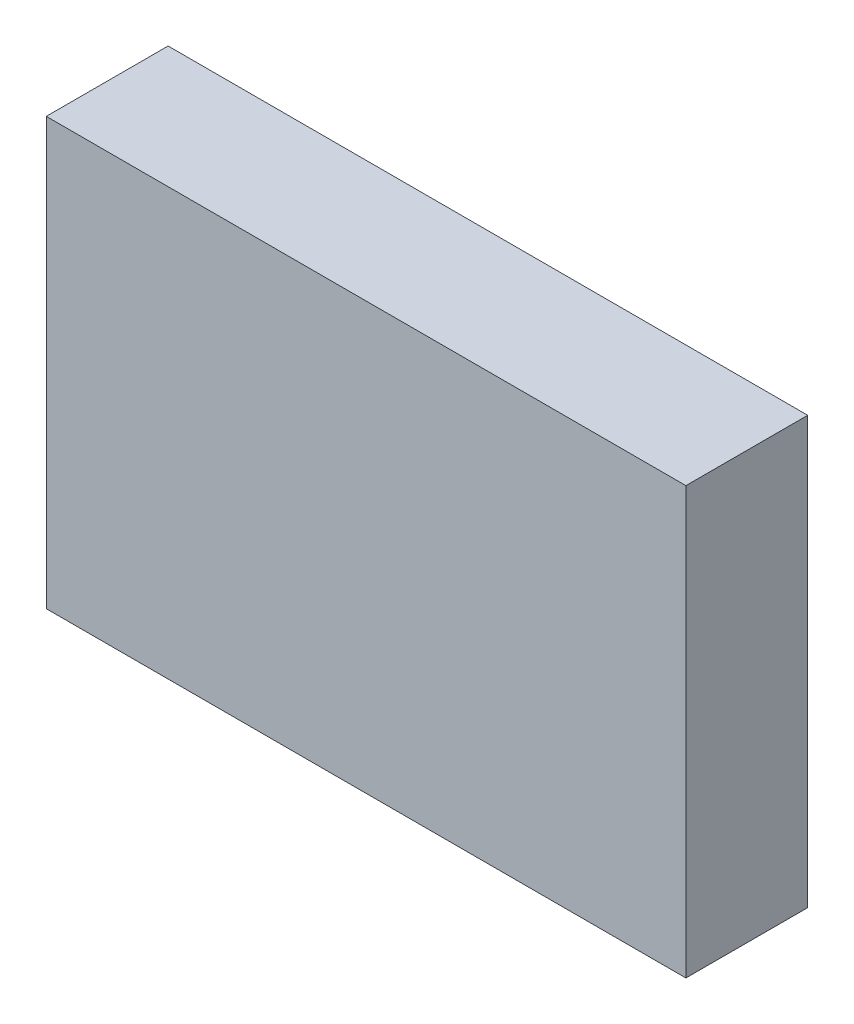
ISO-10303-21;
HEADER;
FILE_DESCRIPTION(('STEP AP214'),'2;1');
FILE_NAME('part.step','',(''),(''),'','','');
FILE_SCHEMA(('AUTOMOTIVE_DESIGN { 1 0 10303 214 1 1 1 1 }'));
ENDSEC;
DATA;
#1=APPLICATION_CONTEXT('core data for automotive mechanical design processes');
#2=APPLICATION_PROTOCOL_DEFINITION('international standard','automotive_design',2000,#1);
#3=PRODUCT_CONTEXT('',#1,'mechanical');
#4=PRODUCT('Part','Part','',(#3));
#5=PRODUCT_RELATED_PRODUCT_CATEGORY('part','',(#4));
#6=PRODUCT_DEFINITION_FORMATION('','',#4);
#7=PRODUCT_DEFINITION_CONTEXT('part definition',#1,'design');
#8=PRODUCT_DEFINITION('design','',#6,#7);
#9=PRODUCT_DEFINITION_SHAPE('','',#8);
#10=(LENGTH_UNIT() NAMED_UNIT(*) SI_UNIT(.MILLI.,.METRE.));
#11=(NAMED_UNIT(*) PLANE_ANGLE_UNIT() SI_UNIT($,.RADIAN.));
#12=(NAMED_UNIT(*) SI_UNIT($,.STERADIAN.) SOLID_ANGLE_UNIT());
#13=UNCERTAINTY_MEASURE_WITH_UNIT(LENGTH_MEASURE(1.E-05),#10,'distance_accuracy_value','');
#14=(GEOMETRIC_REPRESENTATION_CONTEXT(3) GLOBAL_UNCERTAINTY_ASSIGNED_CONTEXT((#13)) GLOBAL_UNIT_ASSIGNED_CONTEXT((#10,
#11,#12)) REPRESENTATION_CONTEXT('',''));
#15=CARTESIAN_POINT('',(0.,0.,0.));
#16=DIRECTION('',(0.,0.,1.));
#17=DIRECTION('',(1.,0.,0.));
#18=AXIS2_PLACEMENT_3D('',#15,#16,#17);
#19=CARTESIAN_POINT('',(0.05,0.,0.45));
#20=DIRECTION('',(0.,0.,1.));
#21=DIRECTION('',(1.,0.,0.));
#22=AXIS2_PLACEMENT_3D('',#19,#20,#21);
#23=PLANE('',#22);
#24=DIRECTION('',(0.,1.,0.));
#25=VECTOR('',#24,1.);
#26=CARTESIAN_POINT('',(0.05,0.,0.45));
#27=LINE('',#26,#25);
#28=CARTESIAN_POINT('',(0.05,0.,0.45));
#29=VERTEX_POINT('',#28);
#30=CARTESIAN_POINT('',(0.05,1.4,0.45));
#31=VERTEX_POINT('',#30);
#32=EDGE_CURVE('E89',#29,#31,#27,.T.);
#33=ORIENTED_EDGE('',*,*,#32,.F.);
#34=DIRECTION('',(1.,0.,0.));
#35=VECTOR('',#34,1.);
#36=CARTESIAN_POINT('',(0.05,0.,0.45));
#37=LINE('',#36,#35);
#38=CARTESIAN_POINT('',(2.15,0.,0.45));
#39=VERTEX_POINT('',#38);
#40=EDGE_CURVE('E71',#29,#39,#37,.T.);
#41=ORIENTED_EDGE('',*,*,#40,.T.);
#42=DIRECTION('',(0.,1.,0.));
#43=VECTOR('',#42,1.);
#44=CARTESIAN_POINT('',(2.15,0.,0.45));
#45=LINE('',#44,#43);
#46=CARTESIAN_POINT('',(2.15,1.4,0.45));
#47=VERTEX_POINT('',#46);
#48=EDGE_CURVE('E83',#39,#47,#45,.T.);
#49=ORIENTED_EDGE('',*,*,#48,.T.);
#50=DIRECTION('',(1.,0.,0.));
#51=VECTOR('',#50,1.);
#52=CARTESIAN_POINT('',(0.05,1.4,0.45));
#53=LINE('',#52,#51);
#54=EDGE_CURVE('E11',#31,#47,#53,.T.);
#55=ORIENTED_EDGE('',*,*,#54,.F.);
#56=EDGE_LOOP('',(#33,#41,#49,#55));
#57=FACE_BOUND('',#56,.T.);
#58=ADVANCED_FACE('F17',(#57),#23,.T.);
#59=CARTESIAN_POINT('',(0.05,0.,0.05));
#60=DIRECTION('',(0.,0.,1.));
#61=DIRECTION('',(1.,0.,0.));
#62=AXIS2_PLACEMENT_3D('',#59,#60,#61);
#63=PLANE('',#62);
#64=DIRECTION('',(1.,0.,0.));
#65=VECTOR('',#64,1.);
#66=CARTESIAN_POINT('',(0.05,1.4,0.05));
#67=LINE('',#66,#65);
#68=CARTESIAN_POINT('',(0.05,1.4,0.05));
#69=VERTEX_POINT('',#68);
#70=CARTESIAN_POINT('',(2.15,1.4,0.05));
#71=VERTEX_POINT('',#70);
#72=EDGE_CURVE('E20',#69,#71,#67,.T.);
#73=ORIENTED_EDGE('',*,*,#72,.T.);
#74=DIRECTION('',(0.,1.,0.));
#75=VECTOR('',#74,1.);
#76=CARTESIAN_POINT('',(2.15,0.,0.05));
#77=LINE('',#76,#75);
#78=CARTESIAN_POINT('',(2.15,0.,0.05));
#79=VERTEX_POINT('',#78);
#80=EDGE_CURVE('E104',#79,#71,#77,.T.);
#81=ORIENTED_EDGE('',*,*,#80,.F.);
#82=DIRECTION('',(1.,0.,0.));
#83=VECTOR('',#82,1.);
#84=CARTESIAN_POINT('',(0.05,0.,0.05));
#85=LINE('',#84,#83);
#86=CARTESIAN_POINT('',(0.05,0.,0.05));
#87=VERTEX_POINT('',#86);
#88=EDGE_CURVE('E82',#87,#79,#85,.T.);
#89=ORIENTED_EDGE('',*,*,#88,.F.);
#90=DIRECTION('',(0.,1.,0.));
#91=VECTOR('',#90,1.);
#92=CARTESIAN_POINT('',(0.05,0.,0.05));
#93=LINE('',#92,#91);
#94=EDGE_CURVE('E90',#87,#69,#93,.T.);
#95=ORIENTED_EDGE('',*,*,#94,.T.);
#96=EDGE_LOOP('',(#73,#81,#89,#95));
#97=FACE_BOUND('',#96,.T.);
#98=ADVANCED_FACE('F119',(#97),#63,.F.);
#99=CARTESIAN_POINT('',(0.05,1.4,0.05));
#100=DIRECTION('',(0.,1.,0.));
#101=DIRECTION('',(1.,0.,0.));
#102=AXIS2_PLACEMENT_3D('',#99,#100,#101);
#103=PLANE('',#102);
#104=ORIENTED_EDGE('',*,*,#72,.F.);
#105=DIRECTION('',(0.,0.,1.));
#106=VECTOR('',#105,1.);
#107=CARTESIAN_POINT('',(0.05,1.4,0.05));
#108=LINE('',#107,#106);
#109=EDGE_CURVE('E94',#69,#31,#108,.T.);
#110=ORIENTED_EDGE('',*,*,#109,.T.);
#111=ORIENTED_EDGE('',*,*,#54,.T.);
#112=DIRECTION('',(0.,0.,1.));
#113=VECTOR('',#112,1.);
#114=CARTESIAN_POINT('',(2.15,1.4,0.05));
#115=LINE('',#114,#113);
#116=EDGE_CURVE('E107',#71,#47,#115,.T.);
#117=ORIENTED_EDGE('',*,*,#116,.F.);
#118=EDGE_LOOP('',(#104,#110,#111,#117));
#119=FACE_BOUND('',#118,.T.);
#120=ADVANCED_FACE('F118',(#119),#103,.T.);
#121=CARTESIAN_POINT('',(0.05,0.,0.05));
#122=DIRECTION('',(0.,1.,0.));
#123=DIRECTION('',(1.,0.,0.));
#124=AXIS2_PLACEMENT_3D('',#121,#122,#123);
#125=PLANE('',#124);
#126=DIRECTION('',(0.,0.,1.));
#127=VECTOR('',#126,1.);
#128=CARTESIAN_POINT('',(2.15,0.,0.05));
#129=LINE('',#128,#127);
#130=EDGE_CURVE('E77',#79,#39,#129,.T.);
#131=ORIENTED_EDGE('',*,*,#130,.T.);
#132=ORIENTED_EDGE('',*,*,#40,.F.);
#133=DIRECTION('',(0.,0.,1.));
#134=VECTOR('',#133,1.);
#135=CARTESIAN_POINT('',(0.05,0.,0.05));
#136=LINE('',#135,#134);
#137=EDGE_CURVE('E74',#87,#29,#136,.T.);
#138=ORIENTED_EDGE('',*,*,#137,.F.);
#139=ORIENTED_EDGE('',*,*,#88,.T.);
#140=EDGE_LOOP('',(#131,#132,#138,#139));
#141=FACE_BOUND('',#140,.T.);
#142=ADVANCED_FACE('F73',(#141),#125,.F.);
#143=CARTESIAN_POINT('',(2.15,0.,0.05));
#144=DIRECTION('',(1.,0.,0.));
#145=DIRECTION('',(0.,1.,0.));
#146=AXIS2_PLACEMENT_3D('',#143,#144,#145);
#147=PLANE('',#146);
#148=ORIENTED_EDGE('',*,*,#130,.F.);
#149=ORIENTED_EDGE('',*,*,#80,.T.);
#150=ORIENTED_EDGE('',*,*,#116,.T.);
#151=ORIENTED_EDGE('',*,*,#48,.F.);
#152=EDGE_LOOP('',(#148,#149,#150,#151));
#153=FACE_BOUND('',#152,.T.);
#154=ADVANCED_FACE('F117',(#153),#147,.T.);
#155=CARTESIAN_POINT('',(0.05,0.,0.05));
#156=DIRECTION('',(1.,0.,0.));
#157=DIRECTION('',(0.,1.,0.));
#158=AXIS2_PLACEMENT_3D('',#155,#156,#157);
#159=PLANE('',#158);
#160=ORIENTED_EDGE('',*,*,#32,.T.);
#161=ORIENTED_EDGE('',*,*,#109,.F.);
#162=ORIENTED_EDGE('',*,*,#94,.F.);
#163=ORIENTED_EDGE('',*,*,#137,.T.);
#164=EDGE_LOOP('',(#160,#161,#162,#163));
#165=FACE_BOUND('',#164,.T.);
#166=ADVANCED_FACE('F87',(#165),#159,.F.);
#167=CLOSED_SHELL('',(#58,#98,#120,#142,#154,#166));
#168=MANIFOLD_SOLID_BREP('B1',#167);
#169=ADVANCED_BREP_SHAPE_REPRESENTATION('',(#18,#168),#14);
#170=SHAPE_DEFINITION_REPRESENTATION(#9,#169);
ENDSEC;
END-ISO-10303-21;
